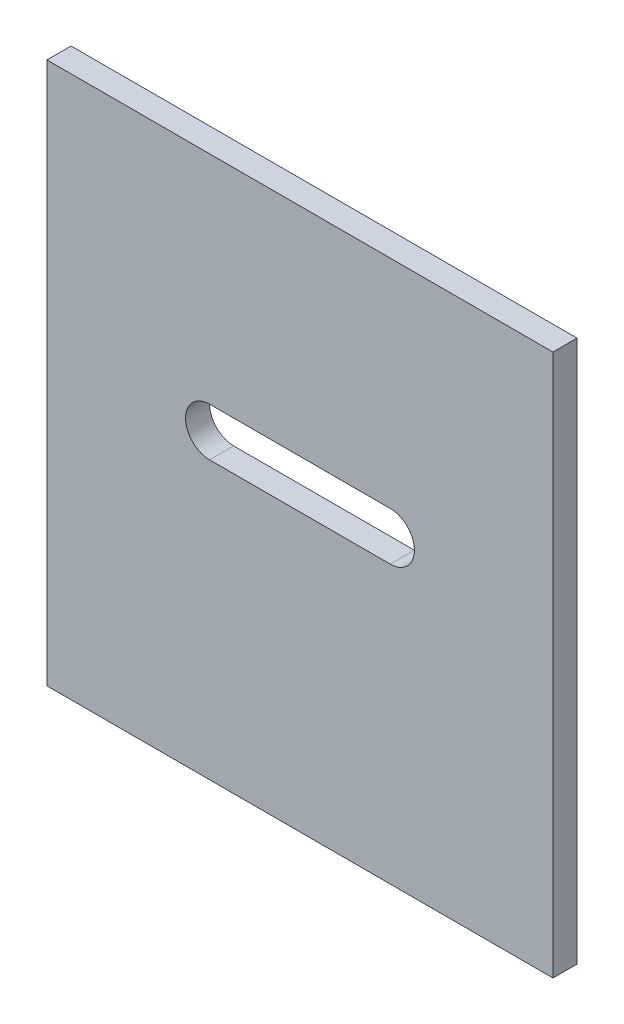
ISO-10303-21;
HEADER;
FILE_DESCRIPTION(('STEP AP214'),'2;1');
FILE_NAME('part.step','',(''),(''),'','','');
FILE_SCHEMA(('AUTOMOTIVE_DESIGN { 1 0 10303 214 1 1 1 1 }'));
ENDSEC;
DATA;
#1=APPLICATION_CONTEXT('core data for automotive mechanical design processes');
#2=APPLICATION_PROTOCOL_DEFINITION('international standard','automotive_design',2000,#1);
#3=PRODUCT_CONTEXT('',#1,'mechanical');
#4=PRODUCT('Part','Part','',(#3));
#5=PRODUCT_RELATED_PRODUCT_CATEGORY('part','',(#4));
#6=PRODUCT_DEFINITION_FORMATION('','',#4);
#7=PRODUCT_DEFINITION_CONTEXT('part definition',#1,'design');
#8=PRODUCT_DEFINITION('design','',#6,#7);
#9=PRODUCT_DEFINITION_SHAPE('','',#8);
#10=(LENGTH_UNIT() NAMED_UNIT(*) SI_UNIT(.MILLI.,.METRE.));
#11=(NAMED_UNIT(*) PLANE_ANGLE_UNIT() SI_UNIT($,.RADIAN.));
#12=(NAMED_UNIT(*) SI_UNIT($,.STERADIAN.) SOLID_ANGLE_UNIT());
#13=UNCERTAINTY_MEASURE_WITH_UNIT(LENGTH_MEASURE(1.E-05),#10,'distance_accuracy_value','');
#14=(GEOMETRIC_REPRESENTATION_CONTEXT(3) GLOBAL_UNCERTAINTY_ASSIGNED_CONTEXT((#13)) GLOBAL_UNIT_ASSIGNED_CONTEXT((#10,
#11,#12)) REPRESENTATION_CONTEXT('',''));
#15=CARTESIAN_POINT('',(0.,0.,0.));
#16=DIRECTION('',(0.,0.,1.));
#17=DIRECTION('',(1.,0.,0.));
#18=AXIS2_PLACEMENT_3D('',#15,#16,#17);
#19=CARTESIAN_POINT('',(21.,22.5,2.));
#20=DIRECTION('',(-1.,0.,0.));
#21=DIRECTION('',(0.,0.,1.));
#22=AXIS2_PLACEMENT_3D('',#19,#20,#21);
#23=PLANE('',#22);
#24=DIRECTION('',(0.,1.,0.));
#25=VECTOR('',#24,1.);
#26=CARTESIAN_POINT('',(21.,22.5,0.));
#27=LINE('',#26,#25);
#28=CARTESIAN_POINT('',(21.,-22.5,0.));
#29=VERTEX_POINT('',#28);
#30=CARTESIAN_POINT('',(21.,22.5,0.));
#31=VERTEX_POINT('',#30);
#32=EDGE_CURVE('E131',#29,#31,#27,.T.);
#33=ORIENTED_EDGE('',*,*,#32,.T.);
#34=DIRECTION('',(0.,0.,-1.));
#35=VECTOR('',#34,1.);
#36=CARTESIAN_POINT('',(21.,22.5,2.));
#37=LINE('',#36,#35);
#38=CARTESIAN_POINT('',(21.,22.5,2.));
#39=VERTEX_POINT('',#38);
#40=EDGE_CURVE('E11',#39,#31,#37,.T.);
#41=ORIENTED_EDGE('',*,*,#40,.F.);
#42=DIRECTION('',(0.,1.,0.));
#43=VECTOR('',#42,1.);
#44=CARTESIAN_POINT('',(21.,22.5,2.));
#45=LINE('',#44,#43);
#46=CARTESIAN_POINT('',(21.,-22.5,2.));
#47=VERTEX_POINT('',#46);
#48=EDGE_CURVE('E135',#47,#39,#45,.T.);
#49=ORIENTED_EDGE('',*,*,#48,.F.);
#50=DIRECTION('',(0.,0.,-1.));
#51=VECTOR('',#50,1.);
#52=CARTESIAN_POINT('',(21.,-22.5,2.));
#53=LINE('',#52,#51);
#54=EDGE_CURVE('E145',#47,#29,#53,.T.);
#55=ORIENTED_EDGE('',*,*,#54,.T.);
#56=EDGE_LOOP('',(#33,#41,#49,#55));
#57=FACE_BOUND('',#56,.T.);
#58=ADVANCED_FACE('F34',(#57),#23,.F.);
#59=CARTESIAN_POINT('',(-21.,22.5,2.));
#60=DIRECTION('',(0.,-1.,0.));
#61=DIRECTION('',(0.,0.,-1.));
#62=AXIS2_PLACEMENT_3D('',#59,#60,#61);
#63=PLANE('',#62);
#64=DIRECTION('',(-1.,0.,0.));
#65=VECTOR('',#64,1.);
#66=CARTESIAN_POINT('',(-21.,22.5,0.));
#67=LINE('',#66,#65);
#68=CARTESIAN_POINT('',(-21.,22.5,0.));
#69=VERTEX_POINT('',#68);
#70=EDGE_CURVE('E148',#31,#69,#67,.T.);
#71=ORIENTED_EDGE('',*,*,#70,.T.);
#72=DIRECTION('',(0.,0.,-1.));
#73=VECTOR('',#72,1.);
#74=CARTESIAN_POINT('',(-21.,22.5,2.));
#75=LINE('',#74,#73);
#76=CARTESIAN_POINT('',(-21.,22.5,2.));
#77=VERTEX_POINT('',#76);
#78=EDGE_CURVE('E41',#77,#69,#75,.T.);
#79=ORIENTED_EDGE('',*,*,#78,.F.);
#80=DIRECTION('',(-1.,0.,0.));
#81=VECTOR('',#80,1.);
#82=CARTESIAN_POINT('',(-21.,22.5,2.));
#83=LINE('',#82,#81);
#84=EDGE_CURVE('E138',#39,#77,#83,.T.);
#85=ORIENTED_EDGE('',*,*,#84,.F.);
#86=ORIENTED_EDGE('',*,*,#40,.T.);
#87=EDGE_LOOP('',(#71,#79,#85,#86));
#88=FACE_BOUND('',#87,.T.);
#89=ADVANCED_FACE('F176',(#88),#63,.F.);
#90=CARTESIAN_POINT('',(-21.,22.5,2.));
#91=DIRECTION('',(1.,0.,0.));
#92=DIRECTION('',(0.,1.,0.));
#93=AXIS2_PLACEMENT_3D('',#90,#91,#92);
#94=PLANE('',#93);
#95=DIRECTION('',(0.,-1.,0.));
#96=VECTOR('',#95,1.);
#97=CARTESIAN_POINT('',(-21.,22.5,0.));
#98=LINE('',#97,#96);
#99=CARTESIAN_POINT('',(-21.,-22.5,0.));
#100=VERTEX_POINT('',#99);
#101=EDGE_CURVE('E150',#69,#100,#98,.T.);
#102=ORIENTED_EDGE('',*,*,#101,.T.);
#103=DIRECTION('',(0.,0.,-1.));
#104=VECTOR('',#103,1.);
#105=CARTESIAN_POINT('',(-21.,-22.5,2.));
#106=LINE('',#105,#104);
#107=CARTESIAN_POINT('',(-21.,-22.5,2.));
#108=VERTEX_POINT('',#107);
#109=EDGE_CURVE('E155',#108,#100,#106,.T.);
#110=ORIENTED_EDGE('',*,*,#109,.F.);
#111=DIRECTION('',(0.,-1.,0.));
#112=VECTOR('',#111,1.);
#113=CARTESIAN_POINT('',(-21.,22.5,2.));
#114=LINE('',#113,#112);
#115=EDGE_CURVE('E141',#77,#108,#114,.T.);
#116=ORIENTED_EDGE('',*,*,#115,.F.);
#117=ORIENTED_EDGE('',*,*,#78,.T.);
#118=EDGE_LOOP('',(#102,#110,#116,#117));
#119=FACE_BOUND('',#118,.T.);
#120=ADVANCED_FACE('F162',(#119),#94,.F.);
#121=CARTESIAN_POINT('',(-21.,-22.5,2.));
#122=DIRECTION('',(0.,1.,0.));
#123=DIRECTION('',(0.,0.,1.));
#124=AXIS2_PLACEMENT_3D('',#121,#122,#123);
#125=PLANE('',#124);
#126=DIRECTION('',(1.,0.,0.));
#127=VECTOR('',#126,1.);
#128=CARTESIAN_POINT('',(-21.,-22.5,0.));
#129=LINE('',#128,#127);
#130=EDGE_CURVE('E139',#100,#29,#129,.T.);
#131=ORIENTED_EDGE('',*,*,#130,.T.);
#132=ORIENTED_EDGE('',*,*,#54,.F.);
#133=DIRECTION('',(1.,0.,0.));
#134=VECTOR('',#133,1.);
#135=CARTESIAN_POINT('',(-21.,-22.5,2.));
#136=LINE('',#135,#134);
#137=EDGE_CURVE('E143',#108,#47,#136,.T.);
#138=ORIENTED_EDGE('',*,*,#137,.F.);
#139=ORIENTED_EDGE('',*,*,#109,.T.);
#140=EDGE_LOOP('',(#131,#132,#138,#139));
#141=FACE_BOUND('',#140,.T.);
#142=ADVANCED_FACE('F169',(#141),#125,.F.);
#143=CARTESIAN_POINT('',(0.,0.,2.));
#144=DIRECTION('',(0.,0.,1.));
#145=DIRECTION('',(1.,0.,0.));
#146=AXIS2_PLACEMENT_3D('',#143,#144,#145);
#147=PLANE('',#146);
#148=CARTESIAN_POINT('',(-7.49999999999999,2.50000000000001,2.));
#149=DIRECTION('',(0.,0.,1.));
#150=DIRECTION('',(1.,0.,0.));
#151=AXIS2_PLACEMENT_3D('',#148,#149,#150);
#152=CIRCLE('',#151,2.);
#153=CARTESIAN_POINT('',(-7.49999999999999,4.50000000000001,2.));
#154=VERTEX_POINT('',#153);
#155=CARTESIAN_POINT('',(-7.49999999999999,0.500000000000002,2.));
#156=VERTEX_POINT('',#155);
#157=EDGE_CURVE('E48',#154,#156,#152,.T.);
#158=ORIENTED_EDGE('',*,*,#157,.F.);
#159=DIRECTION('',(-1.,0.,0.));
#160=VECTOR('',#159,1.);
#161=CARTESIAN_POINT('',(-7.49999999999999,4.50000000000001,2.));
#162=LINE('',#161,#160);
#163=CARTESIAN_POINT('',(7.50000000000001,4.50000000000001,2.));
#164=VERTEX_POINT('',#163);
#165=EDGE_CURVE('E116',#164,#154,#162,.T.);
#166=ORIENTED_EDGE('',*,*,#165,.F.);
#167=CARTESIAN_POINT('',(7.50000000000001,2.50000000000001,2.));
#168=DIRECTION('',(0.,0.,1.));
#169=DIRECTION('',(1.,0.,0.));
#170=AXIS2_PLACEMENT_3D('',#167,#168,#169);
#171=CIRCLE('',#170,2.);
#172=CARTESIAN_POINT('',(7.50000000000001,0.500000000000006,2.));
#173=VERTEX_POINT('',#172);
#174=EDGE_CURVE('E119',#173,#164,#171,.T.);
#175=ORIENTED_EDGE('',*,*,#174,.F.);
#176=DIRECTION('',(1.,0.,0.));
#177=VECTOR('',#176,1.);
#178=CARTESIAN_POINT('',(-7.49999999999999,0.500000000000002,2.));
#179=LINE('',#178,#177);
#180=EDGE_CURVE('E125',#156,#173,#179,.T.);
#181=ORIENTED_EDGE('',*,*,#180,.F.);
#182=EDGE_LOOP('',(#158,#166,#175,#181));
#183=FACE_BOUND('',#182,.T.);
#184=ORIENTED_EDGE('',*,*,#48,.T.);
#185=ORIENTED_EDGE('',*,*,#84,.T.);
#186=ORIENTED_EDGE('',*,*,#115,.T.);
#187=ORIENTED_EDGE('',*,*,#137,.T.);
#188=EDGE_LOOP('',(#184,#185,#186,#187));
#189=FACE_BOUND('',#188,.T.);
#190=ADVANCED_FACE('F175',(#183,#189),#147,.T.);
#191=CARTESIAN_POINT('',(0.,0.,0.));
#192=DIRECTION('',(0.,0.,1.));
#193=DIRECTION('',(1.,0.,0.));
#194=AXIS2_PLACEMENT_3D('',#191,#192,#193);
#195=PLANE('',#194);
#196=DIRECTION('',(-1.,0.,0.));
#197=VECTOR('',#196,1.);
#198=CARTESIAN_POINT('',(-7.49999999999999,4.50000000000001,0.));
#199=LINE('',#198,#197);
#200=CARTESIAN_POINT('',(7.50000000000001,4.50000000000001,0.));
#201=VERTEX_POINT('',#200);
#202=CARTESIAN_POINT('',(-7.49999999999999,4.50000000000001,0.));
#203=VERTEX_POINT('',#202);
#204=EDGE_CURVE('E106',#201,#203,#199,.T.);
#205=ORIENTED_EDGE('',*,*,#204,.T.);
#206=CARTESIAN_POINT('',(-7.49999999999999,2.50000000000001,0.));
#207=DIRECTION('',(0.,0.,1.));
#208=DIRECTION('',(1.,0.,0.));
#209=AXIS2_PLACEMENT_3D('',#206,#207,#208);
#210=CIRCLE('',#209,2.);
#211=CARTESIAN_POINT('',(-7.49999999999999,0.500000000000002,0.));
#212=VERTEX_POINT('',#211);
#213=EDGE_CURVE('E100',#203,#212,#210,.T.);
#214=ORIENTED_EDGE('',*,*,#213,.T.);
#215=DIRECTION('',(1.,0.,0.));
#216=VECTOR('',#215,1.);
#217=CARTESIAN_POINT('',(-7.49999999999999,0.500000000000002,0.));
#218=LINE('',#217,#216);
#219=CARTESIAN_POINT('',(7.50000000000001,0.500000000000006,0.));
#220=VERTEX_POINT('',#219);
#221=EDGE_CURVE('E109',#212,#220,#218,.T.);
#222=ORIENTED_EDGE('',*,*,#221,.T.);
#223=CARTESIAN_POINT('',(7.50000000000001,2.50000000000001,0.));
#224=DIRECTION('',(0.,0.,1.));
#225=DIRECTION('',(1.,0.,0.));
#226=AXIS2_PLACEMENT_3D('',#223,#224,#225);
#227=CIRCLE('',#226,2.);
#228=EDGE_CURVE('E56',#220,#201,#227,.T.);
#229=ORIENTED_EDGE('',*,*,#228,.T.);
#230=EDGE_LOOP('',(#205,#214,#222,#229));
#231=FACE_BOUND('',#230,.T.);
#232=ORIENTED_EDGE('',*,*,#32,.F.);
#233=ORIENTED_EDGE('',*,*,#130,.F.);
#234=ORIENTED_EDGE('',*,*,#101,.F.);
#235=ORIENTED_EDGE('',*,*,#70,.F.);
#236=EDGE_LOOP('',(#232,#233,#234,#235));
#237=FACE_BOUND('',#236,.T.);
#238=ADVANCED_FACE('F113',(#231,#237),#195,.F.);
#239=CARTESIAN_POINT('',(-7.49999999999999,2.50000000000001,0.));
#240=DIRECTION('',(0.,0.,1.));
#241=DIRECTION('',(1.,0.,0.));
#242=AXIS2_PLACEMENT_3D('',#239,#240,#241);
#243=CYLINDRICAL_SURFACE('',#242,2.);
#244=ORIENTED_EDGE('',*,*,#157,.T.);
#245=DIRECTION('',(0.,0.,1.));
#246=VECTOR('',#245,1.);
#247=CARTESIAN_POINT('',(-7.49999999999999,0.500000000000002,0.));
#248=LINE('',#247,#246);
#249=EDGE_CURVE('E96',#212,#156,#248,.T.);
#250=ORIENTED_EDGE('',*,*,#249,.F.);
#251=ORIENTED_EDGE('',*,*,#213,.F.);
#252=DIRECTION('',(0.,0.,1.));
#253=VECTOR('',#252,1.);
#254=CARTESIAN_POINT('',(-7.49999999999999,4.50000000000001,0.));
#255=LINE('',#254,#253);
#256=EDGE_CURVE('E129',#203,#154,#255,.T.);
#257=ORIENTED_EDGE('',*,*,#256,.T.);
#258=EDGE_LOOP('',(#244,#250,#251,#257));
#259=FACE_BOUND('',#258,.T.);
#260=ADVANCED_FACE('F98',(#259),#243,.F.);
#261=CARTESIAN_POINT('',(-7.49999999999999,4.50000000000001,0.));
#262=DIRECTION('',(0.,1.,0.));
#263=DIRECTION('',(-1.,0.,0.));
#264=AXIS2_PLACEMENT_3D('',#261,#262,#263);
#265=PLANE('',#264);
#266=ORIENTED_EDGE('',*,*,#165,.T.);
#267=ORIENTED_EDGE('',*,*,#256,.F.);
#268=ORIENTED_EDGE('',*,*,#204,.F.);
#269=DIRECTION('',(0.,0.,1.));
#270=VECTOR('',#269,1.);
#271=CARTESIAN_POINT('',(7.50000000000001,4.50000000000001,0.));
#272=LINE('',#271,#270);
#273=EDGE_CURVE('E132',#201,#164,#272,.T.);
#274=ORIENTED_EDGE('',*,*,#273,.T.);
#275=EDGE_LOOP('',(#266,#267,#268,#274));
#276=FACE_BOUND('',#275,.T.);
#277=ADVANCED_FACE('F193',(#276),#265,.F.);
#278=CARTESIAN_POINT('',(7.50000000000001,2.50000000000001,0.));
#279=DIRECTION('',(0.,0.,1.));
#280=DIRECTION('',(1.,0.,0.));
#281=AXIS2_PLACEMENT_3D('',#278,#279,#280);
#282=CYLINDRICAL_SURFACE('',#281,2.);
#283=ORIENTED_EDGE('',*,*,#174,.T.);
#284=ORIENTED_EDGE('',*,*,#273,.F.);
#285=ORIENTED_EDGE('',*,*,#228,.F.);
#286=DIRECTION('',(0.,0.,1.));
#287=VECTOR('',#286,1.);
#288=CARTESIAN_POINT('',(7.50000000000001,0.500000000000006,0.));
#289=LINE('',#288,#287);
#290=EDGE_CURVE('E105',#220,#173,#289,.T.);
#291=ORIENTED_EDGE('',*,*,#290,.T.);
#292=EDGE_LOOP('',(#283,#284,#285,#291));
#293=FACE_BOUND('',#292,.T.);
#294=ADVANCED_FACE('F196',(#293),#282,.F.);
#295=CARTESIAN_POINT('',(-7.49999999999999,0.500000000000002,0.));
#296=DIRECTION('',(0.,-1.,0.));
#297=DIRECTION('',(1.,0.,0.));
#298=AXIS2_PLACEMENT_3D('',#295,#296,#297);
#299=PLANE('',#298);
#300=ORIENTED_EDGE('',*,*,#180,.T.);
#301=ORIENTED_EDGE('',*,*,#290,.F.);
#302=ORIENTED_EDGE('',*,*,#221,.F.);
#303=ORIENTED_EDGE('',*,*,#249,.T.);
#304=EDGE_LOOP('',(#300,#301,#302,#303));
#305=FACE_BOUND('',#304,.T.);
#306=ADVANCED_FACE('F110',(#305),#299,.F.);
#307=CLOSED_SHELL('',(#58,#89,#120,#142,#190,#238,#260,#277,#294,#306));
#308=MANIFOLD_SOLID_BREP('B2',#307);
#309=ADVANCED_BREP_SHAPE_REPRESENTATION('',(#18,#308),#14);
#310=SHAPE_DEFINITION_REPRESENTATION(#9,#309);
ENDSEC;
END-ISO-10303-21;
